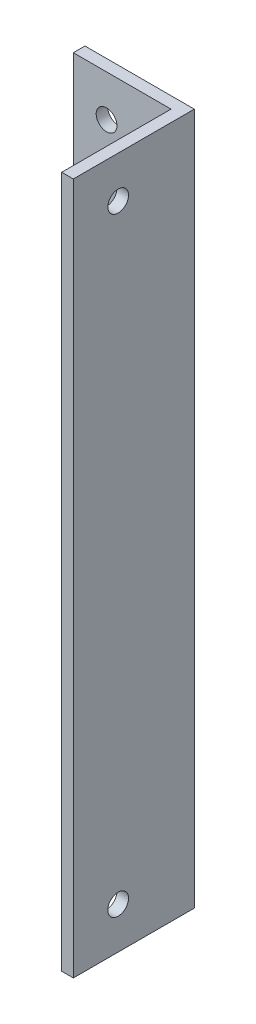
ISO-10303-21;
HEADER;
FILE_DESCRIPTION(('STEP AP214'),'2;1');
FILE_NAME('part.step','',(''),(''),'','','');
FILE_SCHEMA(('AUTOMOTIVE_DESIGN { 1 0 10303 214 1 1 1 1 }'));
ENDSEC;
DATA;
#1=APPLICATION_CONTEXT('core data for automotive mechanical design processes');
#2=APPLICATION_PROTOCOL_DEFINITION('international standard','automotive_design',2000,#1);
#3=PRODUCT_CONTEXT('',#1,'mechanical');
#4=PRODUCT('Part','Part','',(#3));
#5=PRODUCT_RELATED_PRODUCT_CATEGORY('part','',(#4));
#6=PRODUCT_DEFINITION_FORMATION('','',#4);
#7=PRODUCT_DEFINITION_CONTEXT('part definition',#1,'design');
#8=PRODUCT_DEFINITION('design','',#6,#7);
#9=PRODUCT_DEFINITION_SHAPE('','',#8);
#10=(LENGTH_UNIT() NAMED_UNIT(*) SI_UNIT(.MILLI.,.METRE.));
#11=(NAMED_UNIT(*) PLANE_ANGLE_UNIT() SI_UNIT($,.RADIAN.));
#12=(NAMED_UNIT(*) SI_UNIT($,.STERADIAN.) SOLID_ANGLE_UNIT());
#13=UNCERTAINTY_MEASURE_WITH_UNIT(LENGTH_MEASURE(1.E-05),#10,'distance_accuracy_value','');
#14=(GEOMETRIC_REPRESENTATION_CONTEXT(3) GLOBAL_UNCERTAINTY_ASSIGNED_CONTEXT((#13)) GLOBAL_UNIT_ASSIGNED_CONTEXT((#10,
#11,#12)) REPRESENTATION_CONTEXT('',''));
#15=CARTESIAN_POINT('',(0.,0.,0.));
#16=DIRECTION('',(0.,0.,1.));
#17=DIRECTION('',(1.,0.,0.));
#18=AXIS2_PLACEMENT_3D('',#15,#16,#17);
#19=CARTESIAN_POINT('',(0.,0.,1.68));
#20=DIRECTION('',(-1.,0.,0.));
#21=DIRECTION('',(0.,0.,1.));
#22=AXIS2_PLACEMENT_3D('',#19,#20,#21);
#23=PLANE('',#22);
#24=CARTESIAN_POINT('',(0.,6.00000000000001,11.));
#25=DIRECTION('',(-1.,0.,0.));
#26=DIRECTION('',(0.,0.,1.));
#27=AXIS2_PLACEMENT_3D('',#24,#25,#26);
#28=CIRCLE('',#27,1.5);
#29=CARTESIAN_POINT('',(0.,6.00000000000001,12.5));
#30=VERTEX_POINT('',#29);
#31=EDGE_CURVE('E169',#30,#30,#28,.T.);
#32=ORIENTED_EDGE('',*,*,#31,.T.);
#33=EDGE_LOOP('',(#32));
#34=FACE_BOUND('',#33,.T.);
#35=CARTESIAN_POINT('',(0.,94.,11.));
#36=DIRECTION('',(-1.,0.,0.));
#37=DIRECTION('',(0.,0.,1.));
#38=AXIS2_PLACEMENT_3D('',#35,#36,#37);
#39=CIRCLE('',#38,1.5);
#40=CARTESIAN_POINT('',(0.,94.,12.5));
#41=VERTEX_POINT('',#40);
#42=EDGE_CURVE('E145',#41,#41,#39,.T.);
#43=ORIENTED_EDGE('',*,*,#42,.T.);
#44=EDGE_LOOP('',(#43));
#45=FACE_BOUND('',#44,.T.);
#46=DIRECTION('',(0.,1.,0.));
#47=VECTOR('',#46,1.);
#48=CARTESIAN_POINT('',(0.,0.,0.));
#49=LINE('',#48,#47);
#50=CARTESIAN_POINT('',(0.,0.,0.));
#51=VERTEX_POINT('',#50);
#52=CARTESIAN_POINT('',(0.,100.,0.));
#53=VERTEX_POINT('',#52);
#54=EDGE_CURVE('E95',#51,#53,#49,.T.);
#55=ORIENTED_EDGE('',*,*,#54,.T.);
#56=DIRECTION('',(0.,0.,-1.));
#57=VECTOR('',#56,1.);
#58=CARTESIAN_POINT('',(0.,100.,1.68));
#59=LINE('',#58,#57);
#60=CARTESIAN_POINT('',(0.,100.,17.48));
#61=VERTEX_POINT('',#60);
#62=EDGE_CURVE('E11',#61,#53,#59,.T.);
#63=ORIENTED_EDGE('',*,*,#62,.F.);
#64=DIRECTION('',(0.,1.,0.));
#65=VECTOR('',#64,1.);
#66=CARTESIAN_POINT('',(0.,0.,17.48));
#67=LINE('',#66,#65);
#68=CARTESIAN_POINT('',(0.,0.,17.48));
#69=VERTEX_POINT('',#68);
#70=EDGE_CURVE('E97',#69,#61,#67,.T.);
#71=ORIENTED_EDGE('',*,*,#70,.F.);
#72=DIRECTION('',(0.,0.,-1.));
#73=VECTOR('',#72,1.);
#74=CARTESIAN_POINT('',(0.,0.,1.68));
#75=LINE('',#74,#73);
#76=EDGE_CURVE('E81',#69,#51,#75,.T.);
#77=ORIENTED_EDGE('',*,*,#76,.T.);
#78=EDGE_LOOP('',(#55,#63,#71,#77));
#79=FACE_BOUND('',#78,.T.);
#80=ADVANCED_FACE('F37',(#34,#45,#79),#23,.F.);
#81=CARTESIAN_POINT('',(0.,100.,1.68));
#82=DIRECTION('',(0.,-1.,0.));
#83=DIRECTION('',(0.,0.,-1.));
#84=AXIS2_PLACEMENT_3D('',#81,#82,#83);
#85=PLANE('',#84);
#86=DIRECTION('',(-1.,0.,0.));
#87=VECTOR('',#86,1.);
#88=CARTESIAN_POINT('',(0.,100.,0.));
#89=LINE('',#88,#87);
#90=CARTESIAN_POINT('',(-15.8,100.,0.));
#91=VERTEX_POINT('',#90);
#92=EDGE_CURVE('E101',#53,#91,#89,.T.);
#93=ORIENTED_EDGE('',*,*,#92,.T.);
#94=DIRECTION('',(0.,0.,-1.));
#95=VECTOR('',#94,1.);
#96=CARTESIAN_POINT('',(-15.8,100.,1.68));
#97=LINE('',#96,#95);
#98=CARTESIAN_POINT('',(-15.8,100.,1.68));
#99=VERTEX_POINT('',#98);
#100=EDGE_CURVE('E44',#99,#91,#97,.T.);
#101=ORIENTED_EDGE('',*,*,#100,.F.);
#102=DIRECTION('',(-1.,0.,0.));
#103=VECTOR('',#102,1.);
#104=CARTESIAN_POINT('',(0.,100.,1.68));
#105=LINE('',#104,#103);
#106=CARTESIAN_POINT('',(-1.68,100.,1.68));
#107=VERTEX_POINT('',#106);
#108=EDGE_CURVE('E88',#107,#99,#105,.T.);
#109=ORIENTED_EDGE('',*,*,#108,.F.);
#110=DIRECTION('',(0.,0.,-1.));
#111=VECTOR('',#110,1.);
#112=CARTESIAN_POINT('',(-1.68,100.,17.48));
#113=LINE('',#112,#111);
#114=CARTESIAN_POINT('',(-1.68,100.,17.48));
#115=VERTEX_POINT('',#114);
#116=EDGE_CURVE('E102',#115,#107,#113,.T.);
#117=ORIENTED_EDGE('',*,*,#116,.F.);
#118=DIRECTION('',(-1.,0.,0.));
#119=VECTOR('',#118,1.);
#120=CARTESIAN_POINT('',(0.,100.,17.48));
#121=LINE('',#120,#119);
#122=EDGE_CURVE('E122',#61,#115,#121,.T.);
#123=ORIENTED_EDGE('',*,*,#122,.F.);
#124=ORIENTED_EDGE('',*,*,#62,.T.);
#125=EDGE_LOOP('',(#93,#101,#109,#117,#123,#124));
#126=FACE_BOUND('',#125,.T.);
#127=ADVANCED_FACE('F117',(#126),#85,.F.);
#128=CARTESIAN_POINT('',(-15.8,0.,1.68));
#129=DIRECTION('',(1.,0.,0.));
#130=DIRECTION('',(0.,0.,-1.));
#131=AXIS2_PLACEMENT_3D('',#128,#129,#130);
#132=PLANE('',#131);
#133=DIRECTION('',(0.,-1.,0.));
#134=VECTOR('',#133,1.);
#135=CARTESIAN_POINT('',(-15.8,0.,0.));
#136=LINE('',#135,#134);
#137=CARTESIAN_POINT('',(-15.8,0.,0.));
#138=VERTEX_POINT('',#137);
#139=EDGE_CURVE('E89',#91,#138,#136,.T.);
#140=ORIENTED_EDGE('',*,*,#139,.T.);
#141=DIRECTION('',(0.,0.,-1.));
#142=VECTOR('',#141,1.);
#143=CARTESIAN_POINT('',(-15.8,0.,1.68));
#144=LINE('',#143,#142);
#145=CARTESIAN_POINT('',(-15.8,0.,1.68));
#146=VERTEX_POINT('',#145);
#147=EDGE_CURVE('E84',#146,#138,#144,.T.);
#148=ORIENTED_EDGE('',*,*,#147,.F.);
#149=DIRECTION('',(0.,-1.,0.));
#150=VECTOR('',#149,1.);
#151=CARTESIAN_POINT('',(-15.8,0.,1.68));
#152=LINE('',#151,#150);
#153=EDGE_CURVE('E57',#99,#146,#152,.T.);
#154=ORIENTED_EDGE('',*,*,#153,.F.);
#155=ORIENTED_EDGE('',*,*,#100,.T.);
#156=EDGE_LOOP('',(#140,#148,#154,#155));
#157=FACE_BOUND('',#156,.T.);
#158=ADVANCED_FACE('F115',(#157),#132,.F.);
#159=CARTESIAN_POINT('',(0.,0.,1.68));
#160=DIRECTION('',(0.,1.,0.));
#161=DIRECTION('',(-1.,0.,0.));
#162=AXIS2_PLACEMENT_3D('',#159,#160,#161);
#163=PLANE('',#162);
#164=DIRECTION('',(1.,0.,0.));
#165=VECTOR('',#164,1.);
#166=CARTESIAN_POINT('',(0.,0.,0.));
#167=LINE('',#166,#165);
#168=EDGE_CURVE('E77',#138,#51,#167,.T.);
#169=ORIENTED_EDGE('',*,*,#168,.T.);
#170=ORIENTED_EDGE('',*,*,#76,.F.);
#171=DIRECTION('',(1.,0.,0.));
#172=VECTOR('',#171,1.);
#173=CARTESIAN_POINT('',(0.,0.,17.48));
#174=LINE('',#173,#172);
#175=CARTESIAN_POINT('',(-1.68,0.,17.48));
#176=VERTEX_POINT('',#175);
#177=EDGE_CURVE('E136',#176,#69,#174,.T.);
#178=ORIENTED_EDGE('',*,*,#177,.F.);
#179=DIRECTION('',(0.,0.,-1.));
#180=VECTOR('',#179,1.);
#181=CARTESIAN_POINT('',(-1.68,0.,17.48));
#182=LINE('',#181,#180);
#183=CARTESIAN_POINT('',(-1.68,0.,1.68));
#184=VERTEX_POINT('',#183);
#185=EDGE_CURVE('E106',#176,#184,#182,.T.);
#186=ORIENTED_EDGE('',*,*,#185,.T.);
#187=DIRECTION('',(1.,0.,0.));
#188=VECTOR('',#187,1.);
#189=CARTESIAN_POINT('',(0.,0.,1.68));
#190=LINE('',#189,#188);
#191=EDGE_CURVE('E98',#146,#184,#190,.T.);
#192=ORIENTED_EDGE('',*,*,#191,.F.);
#193=ORIENTED_EDGE('',*,*,#147,.T.);
#194=EDGE_LOOP('',(#169,#170,#178,#186,#192,#193));
#195=FACE_BOUND('',#194,.T.);
#196=ADVANCED_FACE('F79',(#195),#163,.F.);
#197=CARTESIAN_POINT('',(0.,0.,1.68));
#198=DIRECTION('',(0.,0.,1.));
#199=DIRECTION('',(1.,0.,0.));
#200=AXIS2_PLACEMENT_3D('',#197,#198,#199);
#201=PLANE('',#200);
#202=CARTESIAN_POINT('',(-11.,6.00000000000001,1.68));
#203=DIRECTION('',(0.,0.,1.));
#204=DIRECTION('',(1.,0.,0.));
#205=AXIS2_PLACEMENT_3D('',#202,#203,#204);
#206=CIRCLE('',#205,1.5);
#207=CARTESIAN_POINT('',(-9.5,6.00000000000001,1.68));
#208=VERTEX_POINT('',#207);
#209=EDGE_CURVE('E190',#208,#208,#206,.T.);
#210=ORIENTED_EDGE('',*,*,#209,.F.);
#211=EDGE_LOOP('',(#210));
#212=FACE_BOUND('',#211,.T.);
#213=CARTESIAN_POINT('',(-11.,94.,1.68));
#214=DIRECTION('',(0.,0.,1.));
#215=DIRECTION('',(1.,0.,0.));
#216=AXIS2_PLACEMENT_3D('',#213,#214,#215);
#217=CIRCLE('',#216,1.5);
#218=CARTESIAN_POINT('',(-9.5,94.,1.68));
#219=VERTEX_POINT('',#218);
#220=EDGE_CURVE('E184',#219,#219,#217,.T.);
#221=ORIENTED_EDGE('',*,*,#220,.F.);
#222=EDGE_LOOP('',(#221));
#223=FACE_BOUND('',#222,.T.);
#224=DIRECTION('',(0.,-1.,0.));
#225=VECTOR('',#224,1.);
#226=CARTESIAN_POINT('',(-1.68,0.,1.68));
#227=LINE('',#226,#225);
#228=EDGE_CURVE('E51',#107,#184,#227,.T.);
#229=ORIENTED_EDGE('',*,*,#228,.F.);
#230=ORIENTED_EDGE('',*,*,#108,.T.);
#231=ORIENTED_EDGE('',*,*,#153,.T.);
#232=ORIENTED_EDGE('',*,*,#191,.T.);
#233=EDGE_LOOP('',(#229,#230,#231,#232));
#234=FACE_BOUND('',#233,.T.);
#235=ADVANCED_FACE('F147',(#212,#223,#234),#201,.T.);
#236=CARTESIAN_POINT('',(0.,0.,0.));
#237=DIRECTION('',(0.,0.,1.));
#238=DIRECTION('',(1.,0.,0.));
#239=AXIS2_PLACEMENT_3D('',#236,#237,#238);
#240=PLANE('',#239);
#241=CARTESIAN_POINT('',(-11.,6.00000000000001,0.));
#242=DIRECTION('',(0.,0.,1.));
#243=DIRECTION('',(1.,0.,0.));
#244=AXIS2_PLACEMENT_3D('',#241,#242,#243);
#245=CIRCLE('',#244,1.5);
#246=CARTESIAN_POINT('',(-9.5,6.00000000000001,0.));
#247=VERTEX_POINT('',#246);
#248=EDGE_CURVE('E187',#247,#247,#245,.T.);
#249=ORIENTED_EDGE('',*,*,#248,.T.);
#250=EDGE_LOOP('',(#249));
#251=FACE_BOUND('',#250,.T.);
#252=CARTESIAN_POINT('',(-11.,94.,0.));
#253=DIRECTION('',(0.,0.,1.));
#254=DIRECTION('',(1.,0.,0.));
#255=AXIS2_PLACEMENT_3D('',#252,#253,#254);
#256=CIRCLE('',#255,1.5);
#257=CARTESIAN_POINT('',(-9.5,94.,0.));
#258=VERTEX_POINT('',#257);
#259=EDGE_CURVE('E182',#258,#258,#256,.T.);
#260=ORIENTED_EDGE('',*,*,#259,.T.);
#261=EDGE_LOOP('',(#260));
#262=FACE_BOUND('',#261,.T.);
#263=ORIENTED_EDGE('',*,*,#54,.F.);
#264=ORIENTED_EDGE('',*,*,#168,.F.);
#265=ORIENTED_EDGE('',*,*,#139,.F.);
#266=ORIENTED_EDGE('',*,*,#92,.F.);
#267=EDGE_LOOP('',(#263,#264,#265,#266));
#268=FACE_BOUND('',#267,.T.);
#269=ADVANCED_FACE('F100',(#251,#262,#268),#240,.F.);
#270=CARTESIAN_POINT('',(-1.68,0.,17.48));
#271=DIRECTION('',(1.,0.,0.));
#272=DIRECTION('',(0.,0.,-1.));
#273=AXIS2_PLACEMENT_3D('',#270,#271,#272);
#274=PLANE('',#273);
#275=CARTESIAN_POINT('',(-1.68,6.00000000000001,11.));
#276=DIRECTION('',(-1.,0.,0.));
#277=DIRECTION('',(0.,0.,1.));
#278=AXIS2_PLACEMENT_3D('',#275,#276,#277);
#279=CIRCLE('',#278,1.5);
#280=CARTESIAN_POINT('',(-1.68,6.00000000000001,12.5));
#281=VERTEX_POINT('',#280);
#282=EDGE_CURVE('E178',#281,#281,#279,.T.);
#283=ORIENTED_EDGE('',*,*,#282,.F.);
#284=EDGE_LOOP('',(#283));
#285=FACE_BOUND('',#284,.T.);
#286=CARTESIAN_POINT('',(-1.68,94.,11.));
#287=DIRECTION('',(-1.,0.,0.));
#288=DIRECTION('',(0.,0.,1.));
#289=AXIS2_PLACEMENT_3D('',#286,#287,#288);
#290=CIRCLE('',#289,1.5);
#291=CARTESIAN_POINT('',(-1.68,94.,12.5));
#292=VERTEX_POINT('',#291);
#293=EDGE_CURVE('E173',#292,#292,#290,.T.);
#294=ORIENTED_EDGE('',*,*,#293,.F.);
#295=EDGE_LOOP('',(#294));
#296=FACE_BOUND('',#295,.T.);
#297=ORIENTED_EDGE('',*,*,#228,.T.);
#298=ORIENTED_EDGE('',*,*,#185,.F.);
#299=DIRECTION('',(0.,-1.,0.));
#300=VECTOR('',#299,1.);
#301=CARTESIAN_POINT('',(-1.68,0.,17.48));
#302=LINE('',#301,#300);
#303=EDGE_CURVE('E133',#115,#176,#302,.T.);
#304=ORIENTED_EDGE('',*,*,#303,.F.);
#305=ORIENTED_EDGE('',*,*,#116,.T.);
#306=EDGE_LOOP('',(#297,#298,#304,#305));
#307=FACE_BOUND('',#306,.T.);
#308=ADVANCED_FACE('F140',(#285,#296,#307),#274,.F.);
#309=CARTESIAN_POINT('',(0.,0.,17.48));
#310=DIRECTION('',(0.,0.,1.));
#311=DIRECTION('',(1.,0.,0.));
#312=AXIS2_PLACEMENT_3D('',#309,#310,#311);
#313=PLANE('',#312);
#314=ORIENTED_EDGE('',*,*,#70,.T.);
#315=ORIENTED_EDGE('',*,*,#122,.T.);
#316=ORIENTED_EDGE('',*,*,#303,.T.);
#317=ORIENTED_EDGE('',*,*,#177,.T.);
#318=EDGE_LOOP('',(#314,#315,#316,#317));
#319=FACE_BOUND('',#318,.T.);
#320=ADVANCED_FACE('F135',(#319),#313,.T.);
#321=CARTESIAN_POINT('',(0.,94.,11.));
#322=DIRECTION('',(-1.,0.,0.));
#323=DIRECTION('',(0.,0.,1.));
#324=AXIS2_PLACEMENT_3D('',#321,#322,#323);
#325=CYLINDRICAL_SURFACE('',#324,1.5);
#326=ORIENTED_EDGE('',*,*,#42,.F.);
#327=EDGE_LOOP('',(#326));
#328=FACE_BOUND('',#327,.T.);
#329=ORIENTED_EDGE('',*,*,#293,.T.);
#330=EDGE_LOOP('',(#329));
#331=FACE_BOUND('',#330,.T.);
#332=ADVANCED_FACE('F211',(#328,#331),#325,.F.);
#333=CARTESIAN_POINT('',(0.,6.00000000000001,11.));
#334=DIRECTION('',(-1.,0.,0.));
#335=DIRECTION('',(0.,0.,1.));
#336=AXIS2_PLACEMENT_3D('',#333,#334,#335);
#337=CYLINDRICAL_SURFACE('',#336,1.5);
#338=ORIENTED_EDGE('',*,*,#31,.F.);
#339=EDGE_LOOP('',(#338));
#340=FACE_BOUND('',#339,.T.);
#341=ORIENTED_EDGE('',*,*,#282,.T.);
#342=EDGE_LOOP('',(#341));
#343=FACE_BOUND('',#342,.T.);
#344=ADVANCED_FACE('F205',(#340,#343),#337,.F.);
#345=CARTESIAN_POINT('',(-11.,94.,0.));
#346=DIRECTION('',(0.,0.,1.));
#347=DIRECTION('',(1.,0.,0.));
#348=AXIS2_PLACEMENT_3D('',#345,#346,#347);
#349=CYLINDRICAL_SURFACE('',#348,1.5);
#350=ORIENTED_EDGE('',*,*,#259,.F.);
#351=EDGE_LOOP('',(#350));
#352=FACE_BOUND('',#351,.T.);
#353=ORIENTED_EDGE('',*,*,#220,.T.);
#354=EDGE_LOOP('',(#353));
#355=FACE_BOUND('',#354,.T.);
#356=ADVANCED_FACE('F200',(#352,#355),#349,.F.);
#357=CARTESIAN_POINT('',(-11.,6.00000000000001,0.));
#358=DIRECTION('',(0.,0.,1.));
#359=DIRECTION('',(1.,0.,0.));
#360=AXIS2_PLACEMENT_3D('',#357,#358,#359);
#361=CYLINDRICAL_SURFACE('',#360,1.5);
#362=ORIENTED_EDGE('',*,*,#248,.F.);
#363=EDGE_LOOP('',(#362));
#364=FACE_BOUND('',#363,.T.);
#365=ORIENTED_EDGE('',*,*,#209,.T.);
#366=EDGE_LOOP('',(#365));
#367=FACE_BOUND('',#366,.T.);
#368=ADVANCED_FACE('F197',(#364,#367),#361,.F.);
#369=CLOSED_SHELL('',(#80,#127,#158,#196,#235,#269,#308,#320,#332,#344,#356,#368));
#370=MANIFOLD_SOLID_BREP('B2',#369);
#371=ADVANCED_BREP_SHAPE_REPRESENTATION('',(#18,#370),#14);
#372=SHAPE_DEFINITION_REPRESENTATION(#9,#371);
ENDSEC;
END-ISO-10303-21;
